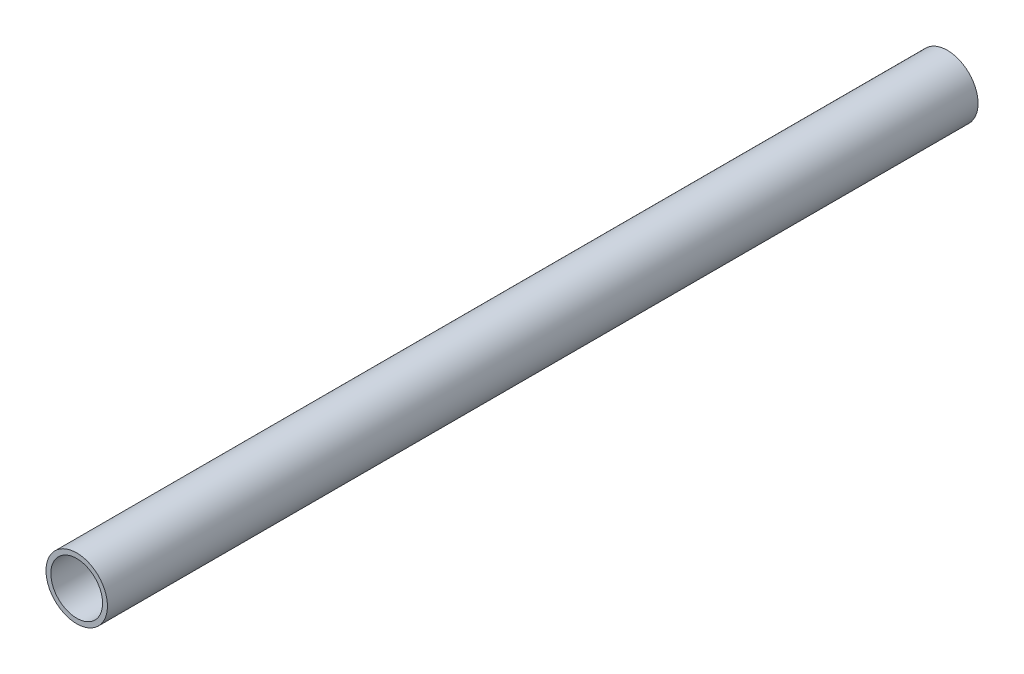
ISO-10303-21;
HEADER;
FILE_DESCRIPTION(('STEP AP214'),'2;1');
FILE_NAME('part.step','',(''),(''),'','','');
FILE_SCHEMA(('AUTOMOTIVE_DESIGN { 1 0 10303 214 1 1 1 1 }'));
ENDSEC;
DATA;
#1=APPLICATION_CONTEXT('core data for automotive mechanical design processes');
#2=APPLICATION_PROTOCOL_DEFINITION('international standard','automotive_design',2000,#1);
#3=PRODUCT_CONTEXT('',#1,'mechanical');
#4=PRODUCT('Part','Part','',(#3));
#5=PRODUCT_RELATED_PRODUCT_CATEGORY('part','',(#4));
#6=PRODUCT_DEFINITION_FORMATION('','',#4);
#7=PRODUCT_DEFINITION_CONTEXT('part definition',#1,'design');
#8=PRODUCT_DEFINITION('design','',#6,#7);
#9=PRODUCT_DEFINITION_SHAPE('','',#8);
#10=(LENGTH_UNIT() NAMED_UNIT(*) SI_UNIT(.MILLI.,.METRE.));
#11=(NAMED_UNIT(*) PLANE_ANGLE_UNIT() SI_UNIT($,.RADIAN.));
#12=(NAMED_UNIT(*) SI_UNIT($,.STERADIAN.) SOLID_ANGLE_UNIT());
#13=UNCERTAINTY_MEASURE_WITH_UNIT(LENGTH_MEASURE(1.E-05),#10,'distance_accuracy_value','');
#14=(GEOMETRIC_REPRESENTATION_CONTEXT(3) GLOBAL_UNCERTAINTY_ASSIGNED_CONTEXT((#13)) GLOBAL_UNIT_ASSIGNED_CONTEXT((#10,
#11,#12)) REPRESENTATION_CONTEXT('',''));
#15=CARTESIAN_POINT('',(0.,0.,0.));
#16=DIRECTION('',(0.,0.,1.));
#17=DIRECTION('',(1.,0.,0.));
#18=AXIS2_PLACEMENT_3D('',#15,#16,#17);
#19=CARTESIAN_POINT('',(0.,0.,180.));
#20=DIRECTION('',(0.,0.,1.));
#21=DIRECTION('',(1.,0.,0.));
#22=AXIS2_PLACEMENT_3D('',#19,#20,#21);
#23=PLANE('',#22);
#24=CARTESIAN_POINT('',(0.,0.,180.));
#25=DIRECTION('',(0.,0.,1.));
#26=DIRECTION('',(1.,0.,0.));
#27=AXIS2_PLACEMENT_3D('',#24,#25,#26);
#28=CIRCLE('',#27,6.35);
#29=CARTESIAN_POINT('',(-6.35,0.,180.));
#30=VERTEX_POINT('',#29);
#31=EDGE_CURVE('E10',#30,#30,#28,.T.);
#32=ORIENTED_EDGE('',*,*,#31,.T.);
#33=EDGE_LOOP('',(#32));
#34=FACE_BOUND('',#33,.T.);
#35=CARTESIAN_POINT('',(0.,0.,180.));
#36=DIRECTION('',(0.,0.,1.));
#37=DIRECTION('',(1.,0.,0.));
#38=AXIS2_PLACEMENT_3D('',#35,#36,#37);
#39=CIRCLE('',#38,5.35);
#40=CARTESIAN_POINT('',(-5.35,0.,180.));
#41=VERTEX_POINT('',#40);
#42=EDGE_CURVE('E50',#41,#41,#39,.T.);
#43=ORIENTED_EDGE('',*,*,#42,.F.);
#44=EDGE_LOOP('',(#43));
#45=FACE_BOUND('',#44,.T.);
#46=ADVANCED_FACE('F37',(#34,#45),#23,.T.);
#47=CARTESIAN_POINT('',(0.,0.,0.));
#48=DIRECTION('',(0.,0.,1.));
#49=DIRECTION('',(1.,0.,0.));
#50=AXIS2_PLACEMENT_3D('',#47,#48,#49);
#51=PLANE('',#50);
#52=CARTESIAN_POINT('',(0.,0.,0.));
#53=DIRECTION('',(0.,0.,1.));
#54=DIRECTION('',(1.,0.,0.));
#55=AXIS2_PLACEMENT_3D('',#52,#53,#54);
#56=CIRCLE('',#55,6.35);
#57=CARTESIAN_POINT('',(-6.35,0.,0.));
#58=VERTEX_POINT('',#57);
#59=EDGE_CURVE('E41',#58,#58,#56,.T.);
#60=ORIENTED_EDGE('',*,*,#59,.F.);
#61=EDGE_LOOP('',(#60));
#62=FACE_BOUND('',#61,.T.);
#63=CARTESIAN_POINT('',(0.,0.,0.));
#64=DIRECTION('',(0.,0.,1.));
#65=DIRECTION('',(1.,0.,0.));
#66=AXIS2_PLACEMENT_3D('',#63,#64,#65);
#67=CIRCLE('',#66,5.35);
#68=CARTESIAN_POINT('',(-5.35,0.,0.));
#69=VERTEX_POINT('',#68);
#70=EDGE_CURVE('E52',#69,#69,#67,.T.);
#71=ORIENTED_EDGE('',*,*,#70,.T.);
#72=EDGE_LOOP('',(#71));
#73=FACE_BOUND('',#72,.T.);
#74=ADVANCED_FACE('F64',(#62,#73),#51,.F.);
#75=CARTESIAN_POINT('',(0.,0.,180.));
#76=DIRECTION('',(0.,0.,-1.));
#77=DIRECTION('',(-1.,0.,0.));
#78=AXIS2_PLACEMENT_3D('',#75,#76,#77);
#79=CYLINDRICAL_SURFACE('',#78,6.35);
#80=CARTESIAN_POINT('',(-6.35,0.,180.));
#81=CARTESIAN_POINT('',(-6.35,0.,178.125));
#82=CARTESIAN_POINT('',(-6.35,0.,176.25));
#83=CARTESIAN_POINT('',(-6.35,0.,172.5));
#84=CARTESIAN_POINT('',(-6.35,0.,170.625));
#85=CARTESIAN_POINT('',(-6.35,0.,166.875));
#86=CARTESIAN_POINT('',(-6.35,0.,165.));
#87=CARTESIAN_POINT('',(-6.35,0.,161.25));
#88=CARTESIAN_POINT('',(-6.35,0.,159.375));
#89=CARTESIAN_POINT('',(-6.35,0.,155.625));
#90=CARTESIAN_POINT('',(-6.35,0.,153.75));
#91=CARTESIAN_POINT('',(-6.35,0.,150.));
#92=CARTESIAN_POINT('',(-6.35,0.,148.125));
#93=CARTESIAN_POINT('',(-6.35,0.,144.375));
#94=CARTESIAN_POINT('',(-6.35,0.,142.5));
#95=CARTESIAN_POINT('',(-6.35,0.,138.75));
#96=CARTESIAN_POINT('',(-6.35,0.,136.875));
#97=CARTESIAN_POINT('',(-6.35,0.,133.125));
#98=CARTESIAN_POINT('',(-6.35,0.,131.25));
#99=CARTESIAN_POINT('',(-6.35,0.,127.5));
#100=CARTESIAN_POINT('',(-6.35,0.,125.625));
#101=CARTESIAN_POINT('',(-6.35,0.,121.875));
#102=CARTESIAN_POINT('',(-6.35,0.,120.));
#103=CARTESIAN_POINT('',(-6.35,0.,116.25));
#104=CARTESIAN_POINT('',(-6.35,0.,114.375));
#105=CARTESIAN_POINT('',(-6.35,0.,110.625));
#106=CARTESIAN_POINT('',(-6.35,0.,108.75));
#107=CARTESIAN_POINT('',(-6.35,0.,105.));
#108=CARTESIAN_POINT('',(-6.35,0.,103.125));
#109=CARTESIAN_POINT('',(-6.35,0.,99.375));
#110=CARTESIAN_POINT('',(-6.35,0.,97.5));
#111=CARTESIAN_POINT('',(-6.35,0.,93.75));
#112=CARTESIAN_POINT('',(-6.35,0.,91.875));
#113=CARTESIAN_POINT('',(-6.35,0.,88.125));
#114=CARTESIAN_POINT('',(-6.35,0.,86.25));
#115=CARTESIAN_POINT('',(-6.35,0.,82.5));
#116=CARTESIAN_POINT('',(-6.35,0.,80.625));
#117=CARTESIAN_POINT('',(-6.35,0.,76.875));
#118=CARTESIAN_POINT('',(-6.35,0.,75.));
#119=CARTESIAN_POINT('',(-6.35,0.,71.25));
#120=CARTESIAN_POINT('',(-6.35,0.,69.375));
#121=CARTESIAN_POINT('',(-6.35,0.,65.625));
#122=CARTESIAN_POINT('',(-6.35,0.,63.75));
#123=CARTESIAN_POINT('',(-6.35,0.,60.));
#124=CARTESIAN_POINT('',(-6.35,0.,58.125));
#125=CARTESIAN_POINT('',(-6.35,0.,54.375));
#126=CARTESIAN_POINT('',(-6.35,0.,52.5));
#127=CARTESIAN_POINT('',(-6.35,0.,48.75));
#128=CARTESIAN_POINT('',(-6.35,0.,46.875));
#129=CARTESIAN_POINT('',(-6.35,0.,43.125));
#130=CARTESIAN_POINT('',(-6.35,0.,41.25));
#131=CARTESIAN_POINT('',(-6.35,0.,37.5));
#132=CARTESIAN_POINT('',(-6.35,0.,35.625));
#133=CARTESIAN_POINT('',(-6.35,0.,31.875));
#134=CARTESIAN_POINT('',(-6.35,0.,30.));
#135=CARTESIAN_POINT('',(-6.35,0.,26.25));
#136=CARTESIAN_POINT('',(-6.35,0.,24.375));
#137=CARTESIAN_POINT('',(-6.35,0.,20.625));
#138=CARTESIAN_POINT('',(-6.35,0.,18.75));
#139=CARTESIAN_POINT('',(-6.35,0.,15.));
#140=CARTESIAN_POINT('',(-6.35,0.,13.125));
#141=CARTESIAN_POINT('',(-6.35,0.,9.37499999999998));
#142=CARTESIAN_POINT('',(-6.35,0.,7.49999999999997));
#143=CARTESIAN_POINT('',(-6.35,0.,3.74999999999997));
#144=CARTESIAN_POINT('',(-6.35,0.,1.87499999999997));
#145=CARTESIAN_POINT('',(-6.35,0.,0.));
#146=B_SPLINE_CURVE_WITH_KNOTS('',3,(#80,#81,#82,#83,#84,#85,#86,#87,#88,#89,#90,#91,#92,#93,
#94,#95,#96,#97,#98,#99,#100,#101,#102,#103,#104,#105,#106,#107,#108,#109,#110,#111,#112,#113,
#114,#115,#116,#117,#118,#119,#120,#121,#122,#123,#124,#125,#126,#127,#128,#129,#130,#131,#132,
#133,#134,#135,#136,#137,#138,#139,#140,#141,#142,#143,#144,#145),.UNSPECIFIED.,.F.,.F.,(4,2,2,
2,2,2,2,2,2,2,2,2,2,2,2,2,2,2,2,2,2,2,2,2,2,2,2,2,2,2,2,2,4),(0.,5.62499999999999,11.25,16.875,
22.5,28.125,33.75,39.375,45.,50.625,56.25,61.875,67.5,73.125,78.75,84.375,90.,95.625,101.25,
106.875,112.5,118.125,123.75,129.375,135.,140.625,146.25,151.875,157.5,163.125,168.75,174.375,
180.),.UNSPECIFIED.);
#147=EDGE_CURVE('BSEAM39',#30,#58,#146,.T.);
#148=ORIENTED_EDGE('',*,*,#31,.F.);
#149=ORIENTED_EDGE('',*,*,#59,.T.);
#150=ORIENTED_EDGE('',*,*,#147,.T.);
#151=ORIENTED_EDGE('',*,*,#147,.F.);
#152=EDGE_LOOP('',(#148,#150,#149,#151));
#153=FACE_BOUND('',#152,.T.);
#154=ADVANCED_FACE('F39',(#153),#79,.T.);
#155=CARTESIAN_POINT('',(0.,0.,180.));
#156=DIRECTION('',(0.,0.,-1.));
#157=DIRECTION('',(-1.,0.,0.));
#158=AXIS2_PLACEMENT_3D('',#155,#156,#157);
#159=CYLINDRICAL_SURFACE('',#158,5.35);
#160=CARTESIAN_POINT('',(-5.35,0.,180.));
#161=CARTESIAN_POINT('',(-5.35,0.,178.125));
#162=CARTESIAN_POINT('',(-5.35,0.,176.25));
#163=CARTESIAN_POINT('',(-5.35,0.,172.5));
#164=CARTESIAN_POINT('',(-5.35,0.,170.625));
#165=CARTESIAN_POINT('',(-5.35,0.,166.875));
#166=CARTESIAN_POINT('',(-5.35,0.,165.));
#167=CARTESIAN_POINT('',(-5.35,0.,161.25));
#168=CARTESIAN_POINT('',(-5.35,0.,159.375));
#169=CARTESIAN_POINT('',(-5.35,0.,155.625));
#170=CARTESIAN_POINT('',(-5.35,0.,153.75));
#171=CARTESIAN_POINT('',(-5.35,0.,150.));
#172=CARTESIAN_POINT('',(-5.35,0.,148.125));
#173=CARTESIAN_POINT('',(-5.35,0.,144.375));
#174=CARTESIAN_POINT('',(-5.35,0.,142.5));
#175=CARTESIAN_POINT('',(-5.35,0.,138.75));
#176=CARTESIAN_POINT('',(-5.35,0.,136.875));
#177=CARTESIAN_POINT('',(-5.35,0.,133.125));
#178=CARTESIAN_POINT('',(-5.35,0.,131.25));
#179=CARTESIAN_POINT('',(-5.35,0.,127.5));
#180=CARTESIAN_POINT('',(-5.35,0.,125.625));
#181=CARTESIAN_POINT('',(-5.35,0.,121.875));
#182=CARTESIAN_POINT('',(-5.35,0.,120.));
#183=CARTESIAN_POINT('',(-5.35,0.,116.25));
#184=CARTESIAN_POINT('',(-5.35,0.,114.375));
#185=CARTESIAN_POINT('',(-5.35,0.,110.625));
#186=CARTESIAN_POINT('',(-5.35,0.,108.75));
#187=CARTESIAN_POINT('',(-5.35,0.,105.));
#188=CARTESIAN_POINT('',(-5.35,0.,103.125));
#189=CARTESIAN_POINT('',(-5.35,0.,99.375));
#190=CARTESIAN_POINT('',(-5.35,0.,97.5));
#191=CARTESIAN_POINT('',(-5.35,0.,93.75));
#192=CARTESIAN_POINT('',(-5.35,0.,91.875));
#193=CARTESIAN_POINT('',(-5.35,0.,88.125));
#194=CARTESIAN_POINT('',(-5.35,0.,86.25));
#195=CARTESIAN_POINT('',(-5.35,0.,82.5));
#196=CARTESIAN_POINT('',(-5.35,0.,80.625));
#197=CARTESIAN_POINT('',(-5.35,0.,76.875));
#198=CARTESIAN_POINT('',(-5.35,0.,75.));
#199=CARTESIAN_POINT('',(-5.35,0.,71.25));
#200=CARTESIAN_POINT('',(-5.35,0.,69.375));
#201=CARTESIAN_POINT('',(-5.35,0.,65.625));
#202=CARTESIAN_POINT('',(-5.35,0.,63.75));
#203=CARTESIAN_POINT('',(-5.35,0.,60.));
#204=CARTESIAN_POINT('',(-5.35,0.,58.125));
#205=CARTESIAN_POINT('',(-5.35,0.,54.375));
#206=CARTESIAN_POINT('',(-5.35,0.,52.5));
#207=CARTESIAN_POINT('',(-5.35,0.,48.75));
#208=CARTESIAN_POINT('',(-5.35,0.,46.875));
#209=CARTESIAN_POINT('',(-5.35,0.,43.125));
#210=CARTESIAN_POINT('',(-5.35,0.,41.25));
#211=CARTESIAN_POINT('',(-5.35,0.,37.5));
#212=CARTESIAN_POINT('',(-5.35,0.,35.625));
#213=CARTESIAN_POINT('',(-5.35,0.,31.875));
#214=CARTESIAN_POINT('',(-5.35,0.,30.));
#215=CARTESIAN_POINT('',(-5.35,0.,26.25));
#216=CARTESIAN_POINT('',(-5.35,0.,24.375));
#217=CARTESIAN_POINT('',(-5.35,0.,20.625));
#218=CARTESIAN_POINT('',(-5.35,0.,18.75));
#219=CARTESIAN_POINT('',(-5.35,0.,15.));
#220=CARTESIAN_POINT('',(-5.35,0.,13.125));
#221=CARTESIAN_POINT('',(-5.35,0.,9.37499999999998));
#222=CARTESIAN_POINT('',(-5.35,0.,7.49999999999997));
#223=CARTESIAN_POINT('',(-5.35,0.,3.74999999999997));
#224=CARTESIAN_POINT('',(-5.35,0.,1.87499999999997));
#225=CARTESIAN_POINT('',(-5.35,0.,0.));
#226=B_SPLINE_CURVE_WITH_KNOTS('',3,(#160,#161,#162,#163,#164,#165,#166,#167,#168,#169,#170,
#171,#172,#173,#174,#175,#176,#177,#178,#179,#180,#181,#182,#183,#184,#185,#186,#187,#188,#189,
#190,#191,#192,#193,#194,#195,#196,#197,#198,#199,#200,#201,#202,#203,#204,#205,#206,#207,#208,
#209,#210,#211,#212,#213,#214,#215,#216,#217,#218,#219,#220,#221,#222,#223,#224,#225),
.UNSPECIFIED.,.F.,.F.,(4,2,2,2,2,2,2,2,2,2,2,2,2,2,2,2,2,2,2,2,2,2,2,2,2,2,2,2,2,2,2,2,4),(0.,
5.62499999999999,11.25,16.875,22.5,28.125,33.75,39.375,45.,50.625,56.25,61.875,67.5,73.125,
78.75,84.375,90.,95.625,101.25,106.875,112.5,118.125,123.75,129.375,135.,140.625,146.25,151.875,
157.5,163.125,168.75,174.375,180.),.UNSPECIFIED.);
#227=EDGE_CURVE('BSEAM60',#41,#69,#226,.T.);
#228=ORIENTED_EDGE('',*,*,#42,.T.);
#229=ORIENTED_EDGE('',*,*,#70,.F.);
#230=ORIENTED_EDGE('',*,*,#227,.T.);
#231=ORIENTED_EDGE('',*,*,#227,.F.);
#232=EDGE_LOOP('',(#228,#230,#229,#231));
#233=FACE_BOUND('',#232,.T.);
#234=ADVANCED_FACE('F60',(#233),#159,.F.);
#235=CLOSED_SHELL('',(#46,#74,#154,#234));
#236=MANIFOLD_SOLID_BREP('B2',#235);
#237=ADVANCED_BREP_SHAPE_REPRESENTATION('',(#18,#236),#14);
#238=SHAPE_DEFINITION_REPRESENTATION(#9,#237);
ENDSEC;
END-ISO-10303-21;
